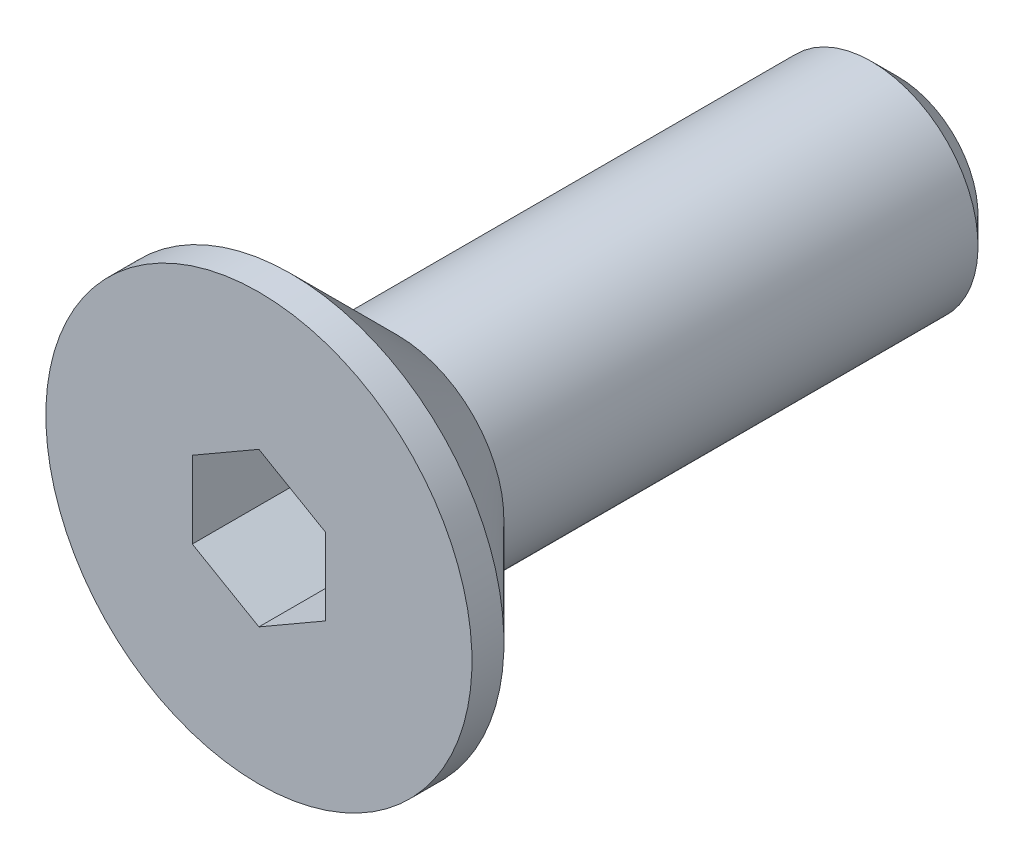
ISO-10303-21;
HEADER;
FILE_DESCRIPTION(('STEP AP214'),'2;1');
FILE_NAME('part.step','',(''),(''),'','','');
FILE_SCHEMA(('AUTOMOTIVE_DESIGN { 1 0 10303 214 1 1 1 1 }'));
ENDSEC;
DATA;
#1=APPLICATION_CONTEXT('core data for automotive mechanical design processes');
#2=APPLICATION_PROTOCOL_DEFINITION('international standard','automotive_design',2000,#1);
#3=PRODUCT_CONTEXT('',#1,'mechanical');
#4=PRODUCT('Part','Part','',(#3));
#5=PRODUCT_RELATED_PRODUCT_CATEGORY('part','',(#4));
#6=PRODUCT_DEFINITION_FORMATION('','',#4);
#7=PRODUCT_DEFINITION_CONTEXT('part definition',#1,'design');
#8=PRODUCT_DEFINITION('design','',#6,#7);
#9=PRODUCT_DEFINITION_SHAPE('','',#8);
#10=(LENGTH_UNIT() NAMED_UNIT(*) SI_UNIT(.MILLI.,.METRE.));
#11=(NAMED_UNIT(*) PLANE_ANGLE_UNIT() SI_UNIT($,.RADIAN.));
#12=(NAMED_UNIT(*) SI_UNIT($,.STERADIAN.) SOLID_ANGLE_UNIT());
#13=UNCERTAINTY_MEASURE_WITH_UNIT(LENGTH_MEASURE(1.E-05),#10,'distance_accuracy_value','');
#14=(GEOMETRIC_REPRESENTATION_CONTEXT(3) GLOBAL_UNCERTAINTY_ASSIGNED_CONTEXT((#13)) GLOBAL_UNIT_ASSIGNED_CONTEXT((#10,
#11,#12)) REPRESENTATION_CONTEXT('',''));
#15=CARTESIAN_POINT('',(0.,0.,0.));
#16=DIRECTION('',(0.,0.,1.));
#17=DIRECTION('',(1.,0.,0.));
#18=AXIS2_PLACEMENT_3D('',#15,#16,#17);
#19=CARTESIAN_POINT('',(0.,0.,6.));
#20=DIRECTION('',(0.,0.,1.));
#21=DIRECTION('',(0.,-1.,0.));
#22=AXIS2_PLACEMENT_3D('',#19,#20,#21);
#23=PLANE('',#22);
#24=DIRECTION('',(-0.866025403784439,0.5,0.));
#25=VECTOR('',#24,1.);
#26=CARTESIAN_POINT('',(1.25,0.721687836487033,6.));
#27=LINE('',#26,#25);
#28=CARTESIAN_POINT('',(1.25,0.721687836487033,6.));
#29=VERTEX_POINT('',#28);
#30=CARTESIAN_POINT('',(0.,1.44337567297406,6.));
#31=VERTEX_POINT('',#30);
#32=EDGE_CURVE('E53',#29,#31,#27,.T.);
#33=ORIENTED_EDGE('',*,*,#32,.F.);
#34=DIRECTION('',(0.,1.,0.));
#35=VECTOR('',#34,1.);
#36=CARTESIAN_POINT('',(1.25,-0.721687836487033,6.));
#37=LINE('',#36,#35);
#38=CARTESIAN_POINT('',(1.25,-0.721687836487033,6.));
#39=VERTEX_POINT('',#38);
#40=EDGE_CURVE('E136',#39,#29,#37,.T.);
#41=ORIENTED_EDGE('',*,*,#40,.F.);
#42=DIRECTION('',(0.866025403784439,0.5,0.));
#43=VECTOR('',#42,1.);
#44=CARTESIAN_POINT('',(0.,-1.44337567297406,6.));
#45=LINE('',#44,#43);
#46=CARTESIAN_POINT('',(0.,-1.44337567297406,6.));
#47=VERTEX_POINT('',#46);
#48=EDGE_CURVE('E134',#47,#39,#45,.T.);
#49=ORIENTED_EDGE('',*,*,#48,.F.);
#50=DIRECTION('',(0.866025403784439,-0.5,0.));
#51=VECTOR('',#50,1.);
#52=CARTESIAN_POINT('',(-1.25,-0.721687836487032,6.));
#53=LINE('',#52,#51);
#54=CARTESIAN_POINT('',(-1.25,-0.721687836487032,6.));
#55=VERTEX_POINT('',#54);
#56=EDGE_CURVE('E101',#55,#47,#53,.T.);
#57=ORIENTED_EDGE('',*,*,#56,.F.);
#58=DIRECTION('',(0.,-1.,0.));
#59=VECTOR('',#58,1.);
#60=CARTESIAN_POINT('',(-1.25,0.721687836487032,6.));
#61=LINE('',#60,#59);
#62=CARTESIAN_POINT('',(-1.25,0.721687836487032,6.));
#63=VERTEX_POINT('',#62);
#64=EDGE_CURVE('E130',#63,#55,#61,.T.);
#65=ORIENTED_EDGE('',*,*,#64,.F.);
#66=DIRECTION('',(-0.866025403784439,-0.5,0.));
#67=VECTOR('',#66,1.);
#68=CARTESIAN_POINT('',(0.,1.44337567297406,6.));
#69=LINE('',#68,#67);
#70=EDGE_CURVE('E127',#31,#63,#69,.T.);
#71=ORIENTED_EDGE('',*,*,#70,.F.);
#72=EDGE_LOOP('',(#33,#41,#49,#57,#65,#71));
#73=FACE_BOUND('',#72,.T.);
#74=CARTESIAN_POINT('',(0.,0.,6.));
#75=DIRECTION('',(0.,0.,-1.));
#76=DIRECTION('',(0.,1.,0.));
#77=AXIS2_PLACEMENT_3D('',#74,#75,#76);
#78=CIRCLE('',#77,4.);
#79=CARTESIAN_POINT('',(0.,4.,6.));
#80=VERTEX_POINT('',#79);
#81=EDGE_CURVE('E151',#80,#80,#78,.T.);
#82=ORIENTED_EDGE('',*,*,#81,.F.);
#83=EDGE_LOOP('',(#82));
#84=FACE_BOUND('',#83,.T.);
#85=ADVANCED_FACE('F37',(#73,#84),#23,.T.);
#86=CARTESIAN_POINT('',(0.,0.,-6.));
#87=DIRECTION('',(0.,0.,-1.));
#88=DIRECTION('',(0.,1.,0.));
#89=AXIS2_PLACEMENT_3D('',#86,#87,#88);
#90=CYLINDRICAL_SURFACE('',#89,4.);
#91=ORIENTED_EDGE('',*,*,#81,.T.);
#92=EDGE_LOOP('',(#91));
#93=FACE_BOUND('',#92,.T.);
#94=CARTESIAN_POINT('',(0.,0.,5.39999999999999));
#95=DIRECTION('',(0.,0.,-1.));
#96=DIRECTION('',(0.,1.,0.));
#97=AXIS2_PLACEMENT_3D('',#94,#95,#96);
#98=CIRCLE('',#97,4.);
#99=CARTESIAN_POINT('',(0.,4.,5.39999999999999));
#100=VERTEX_POINT('',#99);
#101=EDGE_CURVE('E148',#100,#100,#98,.T.);
#102=ORIENTED_EDGE('',*,*,#101,.F.);
#103=EDGE_LOOP('',(#102));
#104=FACE_BOUND('',#103,.T.);
#105=ADVANCED_FACE('F171',(#93,#104),#90,.T.);
#106=CARTESIAN_POINT('',(0.,0.,3.4));
#107=DIRECTION('',(0.,0.,1.));
#108=DIRECTION('',(0.,-1.,0.));
#109=AXIS2_PLACEMENT_3D('',#106,#107,#108);
#110=CONICAL_SURFACE('',#109,2.,0.78539816339745);
#111=ORIENTED_EDGE('',*,*,#101,.T.);
#112=EDGE_LOOP('',(#111));
#113=FACE_BOUND('',#112,.T.);
#114=CARTESIAN_POINT('',(0.,0.,3.4));
#115=DIRECTION('',(0.,0.,-1.));
#116=DIRECTION('',(0.,1.,0.));
#117=AXIS2_PLACEMENT_3D('',#114,#115,#116);
#118=CIRCLE('',#117,2.);
#119=CARTESIAN_POINT('',(0.,2.,3.4));
#120=VERTEX_POINT('',#119);
#121=EDGE_CURVE('E140',#120,#120,#118,.T.);
#122=ORIENTED_EDGE('',*,*,#121,.F.);
#123=EDGE_LOOP('',(#122));
#124=FACE_BOUND('',#123,.T.);
#125=ADVANCED_FACE('F176',(#113,#124),#110,.T.);
#126=CARTESIAN_POINT('',(0.,0.,-6.));
#127=DIRECTION('',(0.,0.,-1.));
#128=DIRECTION('',(0.,1.,0.));
#129=AXIS2_PLACEMENT_3D('',#126,#127,#128);
#130=CYLINDRICAL_SURFACE('',#129,2.);
#131=CARTESIAN_POINT('',(0.,0.,-5.49999999999999));
#132=DIRECTION('',(0.,0.,-1.));
#133=DIRECTION('',(0.,1.,0.));
#134=AXIS2_PLACEMENT_3D('',#131,#132,#133);
#135=CIRCLE('',#134,2.);
#136=CARTESIAN_POINT('',(0.,2.,-5.49999999999999));
#137=VERTEX_POINT('',#136);
#138=EDGE_CURVE('E11',#137,#137,#135,.F.);
#139=ORIENTED_EDGE('',*,*,#138,.T.);
#140=EDGE_LOOP('',(#139));
#141=FACE_BOUND('',#140,.T.);
#142=ORIENTED_EDGE('',*,*,#121,.T.);
#143=EDGE_LOOP('',(#142));
#144=FACE_BOUND('',#143,.T.);
#145=ADVANCED_FACE('F167',(#141,#144),#130,.T.);
#146=CARTESIAN_POINT('',(0.,2.,-6.));
#147=DIRECTION('',(0.,0.,-1.));
#148=DIRECTION('',(0.,1.,0.));
#149=AXIS2_PLACEMENT_3D('',#146,#147,#148);
#150=PLANE('',#149);
#151=CARTESIAN_POINT('',(0.,0.,-6.));
#152=DIRECTION('',(0.,0.,-1.));
#153=DIRECTION('',(0.,1.,0.));
#154=AXIS2_PLACEMENT_3D('',#151,#152,#153);
#155=CIRCLE('',#154,1.49999999999999);
#156=CARTESIAN_POINT('',(0.,1.5,-6.));
#157=VERTEX_POINT('',#156);
#158=EDGE_CURVE('E46',#157,#157,#155,.T.);
#159=ORIENTED_EDGE('',*,*,#158,.T.);
#160=EDGE_LOOP('',(#159));
#161=FACE_BOUND('',#160,.T.);
#162=ADVANCED_FACE('F156',(#161),#150,.T.);
#163=CARTESIAN_POINT('',(0.,0.,-6.));
#164=DIRECTION('',(0.,0.,1.));
#165=DIRECTION('',(0.,-1.,0.));
#166=AXIS2_PLACEMENT_3D('',#163,#164,#165);
#167=CONICAL_SURFACE('',#166,1.49999999999999,0.785398163397446);
#168=ORIENTED_EDGE('',*,*,#138,.F.);
#169=EDGE_LOOP('',(#168));
#170=FACE_BOUND('',#169,.T.);
#171=ORIENTED_EDGE('',*,*,#158,.F.);
#172=EDGE_LOOP('',(#171));
#173=FACE_BOUND('',#172,.T.);
#174=ADVANCED_FACE('F40',(#170,#173),#167,.T.);
#175=CARTESIAN_POINT('',(1.25,0.721687836487033,3.5));
#176=DIRECTION('',(0.5,0.866025403784439,0.));
#177=DIRECTION('',(-0.866025403784439,0.5,0.));
#178=AXIS2_PLACEMENT_3D('',#175,#176,#177);
#179=PLANE('',#178);
#180=ORIENTED_EDGE('',*,*,#32,.T.);
#181=DIRECTION('',(0.,0.,1.));
#182=VECTOR('',#181,1.);
#183=CARTESIAN_POINT('',(0.,1.44337567297406,3.5));
#184=LINE('',#183,#182);
#185=CARTESIAN_POINT('',(0.,1.44337567297406,3.5));
#186=VERTEX_POINT('',#185);
#187=EDGE_CURVE('E83',#186,#31,#184,.T.);
#188=ORIENTED_EDGE('',*,*,#187,.F.);
#189=DIRECTION('',(-0.866025403784439,0.5,0.));
#190=VECTOR('',#189,1.);
#191=CARTESIAN_POINT('',(1.25,0.721687836487033,3.5));
#192=LINE('',#191,#190);
#193=CARTESIAN_POINT('',(1.25,0.721687836487033,3.5));
#194=VERTEX_POINT('',#193);
#195=EDGE_CURVE('E138',#194,#186,#192,.T.);
#196=ORIENTED_EDGE('',*,*,#195,.F.);
#197=DIRECTION('',(0.,0.,1.));
#198=VECTOR('',#197,1.);
#199=CARTESIAN_POINT('',(1.25,0.721687836487033,3.5));
#200=LINE('',#199,#198);
#201=EDGE_CURVE('E61',#194,#29,#200,.T.);
#202=ORIENTED_EDGE('',*,*,#201,.T.);
#203=EDGE_LOOP('',(#180,#188,#196,#202));
#204=FACE_BOUND('',#203,.T.);
#205=ADVANCED_FACE('F159',(#204),#179,.F.);
#206=CARTESIAN_POINT('',(1.25,-0.721687836487033,3.5));
#207=DIRECTION('',(1.,0.,0.));
#208=DIRECTION('',(0.,1.,0.));
#209=AXIS2_PLACEMENT_3D('',#206,#207,#208);
#210=PLANE('',#209);
#211=ORIENTED_EDGE('',*,*,#40,.T.);
#212=ORIENTED_EDGE('',*,*,#201,.F.);
#213=DIRECTION('',(0.,1.,0.));
#214=VECTOR('',#213,1.);
#215=CARTESIAN_POINT('',(1.25,-0.721687836487033,3.5));
#216=LINE('',#215,#214);
#217=CARTESIAN_POINT('',(1.25,-0.721687836487033,3.5));
#218=VERTEX_POINT('',#217);
#219=EDGE_CURVE('E113',#218,#194,#216,.T.);
#220=ORIENTED_EDGE('',*,*,#219,.F.);
#221=DIRECTION('',(0.,0.,1.));
#222=VECTOR('',#221,1.);
#223=CARTESIAN_POINT('',(1.25,-0.721687836487033,3.5));
#224=LINE('',#223,#222);
#225=EDGE_CURVE('E105',#218,#39,#224,.T.);
#226=ORIENTED_EDGE('',*,*,#225,.T.);
#227=EDGE_LOOP('',(#211,#212,#220,#226));
#228=FACE_BOUND('',#227,.T.);
#229=ADVANCED_FACE('F165',(#228),#210,.F.);
#230=CARTESIAN_POINT('',(0.,-1.44337567297406,3.5));
#231=DIRECTION('',(0.5,-0.866025403784439,0.));
#232=DIRECTION('',(0.866025403784439,0.5,0.));
#233=AXIS2_PLACEMENT_3D('',#230,#231,#232);
#234=PLANE('',#233);
#235=ORIENTED_EDGE('',*,*,#48,.T.);
#236=ORIENTED_EDGE('',*,*,#225,.F.);
#237=DIRECTION('',(0.866025403784439,0.5,0.));
#238=VECTOR('',#237,1.);
#239=CARTESIAN_POINT('',(0.,-1.44337567297406,3.5));
#240=LINE('',#239,#238);
#241=CARTESIAN_POINT('',(0.,-1.44337567297406,3.5));
#242=VERTEX_POINT('',#241);
#243=EDGE_CURVE('E109',#242,#218,#240,.T.);
#244=ORIENTED_EDGE('',*,*,#243,.F.);
#245=DIRECTION('',(0.,0.,1.));
#246=VECTOR('',#245,1.);
#247=CARTESIAN_POINT('',(0.,-1.44337567297406,3.5));
#248=LINE('',#247,#246);
#249=EDGE_CURVE('E94',#242,#47,#248,.T.);
#250=ORIENTED_EDGE('',*,*,#249,.T.);
#251=EDGE_LOOP('',(#235,#236,#244,#250));
#252=FACE_BOUND('',#251,.T.);
#253=ADVANCED_FACE('F110',(#252),#234,.F.);
#254=CARTESIAN_POINT('',(-1.25,-0.721687836487032,3.5));
#255=DIRECTION('',(-0.5,-0.866025403784438,0.));
#256=DIRECTION('',(0.866025403784439,-0.5,0.));
#257=AXIS2_PLACEMENT_3D('',#254,#255,#256);
#258=PLANE('',#257);
#259=ORIENTED_EDGE('',*,*,#56,.T.);
#260=ORIENTED_EDGE('',*,*,#249,.F.);
#261=DIRECTION('',(0.866025403784439,-0.5,0.));
#262=VECTOR('',#261,1.);
#263=CARTESIAN_POINT('',(-1.25,-0.721687836487032,3.5));
#264=LINE('',#263,#262);
#265=CARTESIAN_POINT('',(-1.25,-0.721687836487032,3.5));
#266=VERTEX_POINT('',#265);
#267=EDGE_CURVE('E98',#266,#242,#264,.T.);
#268=ORIENTED_EDGE('',*,*,#267,.F.);
#269=DIRECTION('',(0.,0.,1.));
#270=VECTOR('',#269,1.);
#271=CARTESIAN_POINT('',(-1.25,-0.721687836487032,3.5));
#272=LINE('',#271,#270);
#273=EDGE_CURVE('E106',#266,#55,#272,.T.);
#274=ORIENTED_EDGE('',*,*,#273,.T.);
#275=EDGE_LOOP('',(#259,#260,#268,#274));
#276=FACE_BOUND('',#275,.T.);
#277=ADVANCED_FACE('F96',(#276),#258,.F.);
#278=CARTESIAN_POINT('',(-1.25,0.721687836487032,3.5));
#279=DIRECTION('',(-1.,0.,0.));
#280=DIRECTION('',(0.,0.,1.));
#281=AXIS2_PLACEMENT_3D('',#278,#279,#280);
#282=PLANE('',#281);
#283=ORIENTED_EDGE('',*,*,#64,.T.);
#284=ORIENTED_EDGE('',*,*,#273,.F.);
#285=DIRECTION('',(0.,-1.,0.));
#286=VECTOR('',#285,1.);
#287=CARTESIAN_POINT('',(-1.25,0.721687836487032,3.5));
#288=LINE('',#287,#286);
#289=CARTESIAN_POINT('',(-1.25,0.721687836487032,3.5));
#290=VERTEX_POINT('',#289);
#291=EDGE_CURVE('E119',#290,#266,#288,.T.);
#292=ORIENTED_EDGE('',*,*,#291,.F.);
#293=DIRECTION('',(0.,0.,1.));
#294=VECTOR('',#293,1.);
#295=CARTESIAN_POINT('',(-1.25,0.721687836487032,3.5));
#296=LINE('',#295,#294);
#297=EDGE_CURVE('E143',#290,#63,#296,.T.);
#298=ORIENTED_EDGE('',*,*,#297,.T.);
#299=EDGE_LOOP('',(#283,#284,#292,#298));
#300=FACE_BOUND('',#299,.T.);
#301=ADVANCED_FACE('F190',(#300),#282,.F.);
#302=CARTESIAN_POINT('',(0.,1.44337567297406,3.5));
#303=DIRECTION('',(-0.5,0.866025403784439,0.));
#304=DIRECTION('',(-0.866025403784439,-0.5,0.));
#305=AXIS2_PLACEMENT_3D('',#302,#303,#304);
#306=PLANE('',#305);
#307=ORIENTED_EDGE('',*,*,#70,.T.);
#308=ORIENTED_EDGE('',*,*,#297,.F.);
#309=DIRECTION('',(-0.866025403784439,-0.5,0.));
#310=VECTOR('',#309,1.);
#311=CARTESIAN_POINT('',(0.,1.44337567297406,3.5));
#312=LINE('',#311,#310);
#313=EDGE_CURVE('E121',#186,#290,#312,.T.);
#314=ORIENTED_EDGE('',*,*,#313,.F.);
#315=ORIENTED_EDGE('',*,*,#187,.T.);
#316=EDGE_LOOP('',(#307,#308,#314,#315));
#317=FACE_BOUND('',#316,.T.);
#318=ADVANCED_FACE('F187',(#317),#306,.F.);
#319=CARTESIAN_POINT('',(0.,0.,3.5));
#320=DIRECTION('',(0.,0.,1.));
#321=DIRECTION('',(1.,0.,0.));
#322=AXIS2_PLACEMENT_3D('',#319,#320,#321);
#323=PLANE('',#322);
#324=ORIENTED_EDGE('',*,*,#195,.T.);
#325=ORIENTED_EDGE('',*,*,#313,.T.);
#326=ORIENTED_EDGE('',*,*,#291,.T.);
#327=ORIENTED_EDGE('',*,*,#267,.T.);
#328=ORIENTED_EDGE('',*,*,#243,.T.);
#329=ORIENTED_EDGE('',*,*,#219,.T.);
#330=EDGE_LOOP('',(#324,#325,#326,#327,#328,#329));
#331=FACE_BOUND('',#330,.T.);
#332=ADVANCED_FACE('F116',(#331),#323,.T.);
#333=CLOSED_SHELL('',(#85,#105,#125,#145,#162,#174,#205,#229,#253,#277,#301,#318,#332));
#334=MANIFOLD_SOLID_BREP('B2',#333);
#335=ADVANCED_BREP_SHAPE_REPRESENTATION('',(#18,#334),#14);
#336=SHAPE_DEFINITION_REPRESENTATION(#9,#335);
ENDSEC;
END-ISO-10303-21;
